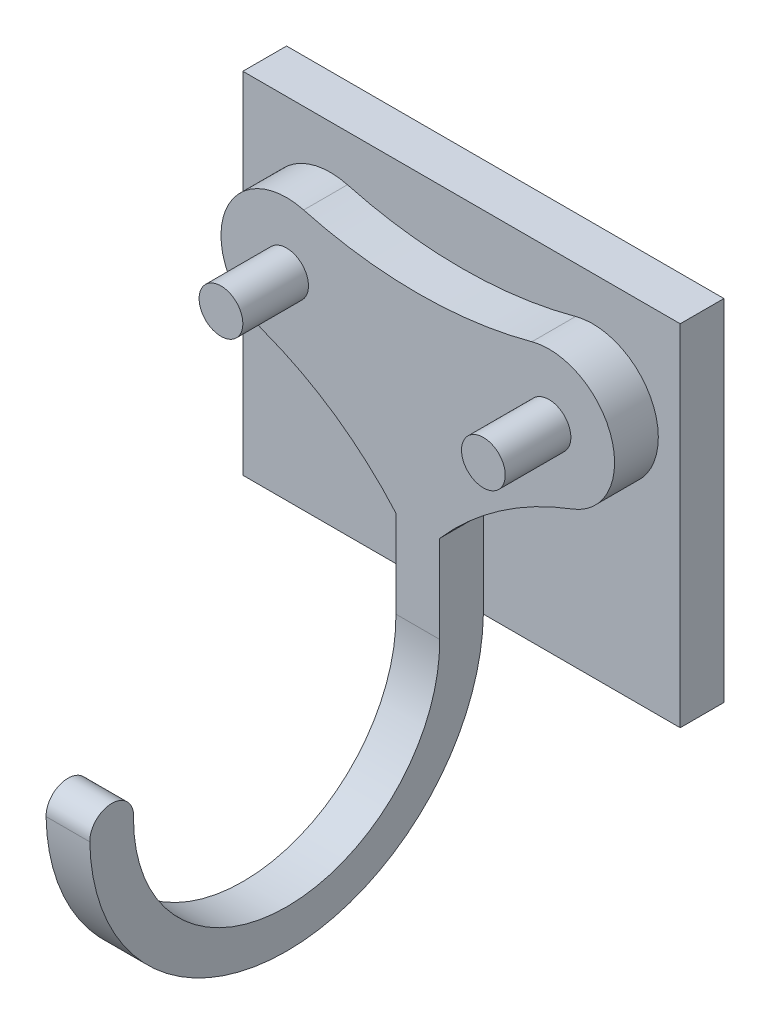
ISO-10303-21;
HEADER;
FILE_DESCRIPTION(('STEP AP214'),'2;1');
FILE_NAME('part.step','',(''),(''),'','','');
FILE_SCHEMA(('AUTOMOTIVE_DESIGN { 1 0 10303 214 1 1 1 1 }'));
ENDSEC;
DATA;
#1=APPLICATION_CONTEXT('core data for automotive mechanical design processes');
#2=APPLICATION_PROTOCOL_DEFINITION('international standard','automotive_design',2000,#1);
#3=PRODUCT_CONTEXT('',#1,'mechanical');
#4=PRODUCT('Part','Part','',(#3));
#5=PRODUCT_RELATED_PRODUCT_CATEGORY('part','',(#4));
#6=PRODUCT_DEFINITION_FORMATION('','',#4);
#7=PRODUCT_DEFINITION_CONTEXT('part definition',#1,'design');
#8=PRODUCT_DEFINITION('design','',#6,#7);
#9=PRODUCT_DEFINITION_SHAPE('','',#8);
#10=(LENGTH_UNIT() NAMED_UNIT(*) SI_UNIT(.MILLI.,.METRE.));
#11=(NAMED_UNIT(*) PLANE_ANGLE_UNIT() SI_UNIT($,.RADIAN.));
#12=(NAMED_UNIT(*) SI_UNIT($,.STERADIAN.) SOLID_ANGLE_UNIT());
#13=UNCERTAINTY_MEASURE_WITH_UNIT(LENGTH_MEASURE(1.E-05),#10,'distance_accuracy_value','');
#14=(GEOMETRIC_REPRESENTATION_CONTEXT(3) GLOBAL_UNCERTAINTY_ASSIGNED_CONTEXT((#13)) GLOBAL_UNIT_ASSIGNED_CONTEXT((#10,
#11,#12)) REPRESENTATION_CONTEXT('',''));
#15=CARTESIAN_POINT('',(0.,0.,0.));
#16=DIRECTION('',(0.,0.,1.));
#17=DIRECTION('',(1.,0.,0.));
#18=AXIS2_PLACEMENT_3D('',#15,#16,#17);
#19=CARTESIAN_POINT('',(-10.,-8.,2.));
#20=DIRECTION('',(-1.,0.,0.));
#21=DIRECTION('',(0.,0.,1.));
#22=AXIS2_PLACEMENT_3D('',#19,#20,#21);
#23=PLANE('',#22);
#24=DIRECTION('',(0.,1.,0.));
#25=VECTOR('',#24,1.);
#26=CARTESIAN_POINT('',(-10.,-8.,0.));
#27=LINE('',#26,#25);
#28=CARTESIAN_POINT('',(-10.,-8.,0.));
#29=VERTEX_POINT('',#28);
#30=CARTESIAN_POINT('',(-10.,8.,0.));
#31=VERTEX_POINT('',#30);
#32=EDGE_CURVE('E202',#29,#31,#27,.T.);
#33=ORIENTED_EDGE('',*,*,#32,.F.);
#34=DIRECTION('',(0.,0.,-1.));
#35=VECTOR('',#34,1.);
#36=CARTESIAN_POINT('',(-10.,-8.,2.));
#37=LINE('',#36,#35);
#38=CARTESIAN_POINT('',(-10.,-8.,2.));
#39=VERTEX_POINT('',#38);
#40=EDGE_CURVE('E11',#39,#29,#37,.T.);
#41=ORIENTED_EDGE('',*,*,#40,.F.);
#42=DIRECTION('',(0.,1.,0.));
#43=VECTOR('',#42,1.);
#44=CARTESIAN_POINT('',(-10.,-8.,2.));
#45=LINE('',#44,#43);
#46=CARTESIAN_POINT('',(-10.,8.,2.));
#47=VERTEX_POINT('',#46);
#48=EDGE_CURVE('E203',#39,#47,#45,.T.);
#49=ORIENTED_EDGE('',*,*,#48,.T.);
#50=DIRECTION('',(0.,0.,-1.));
#51=VECTOR('',#50,1.);
#52=CARTESIAN_POINT('',(-10.,8.,2.));
#53=LINE('',#52,#51);
#54=EDGE_CURVE('E48',#47,#31,#53,.T.);
#55=ORIENTED_EDGE('',*,*,#54,.T.);
#56=EDGE_LOOP('',(#33,#41,#49,#55));
#57=FACE_BOUND('',#56,.T.);
#58=ADVANCED_FACE('F45',(#57),#23,.T.);
#59=CARTESIAN_POINT('',(-10.,-8.,2.));
#60=DIRECTION('',(0.,1.,0.));
#61=DIRECTION('',(0.,0.,1.));
#62=AXIS2_PLACEMENT_3D('',#59,#60,#61);
#63=PLANE('',#62);
#64=DIRECTION('',(0.,0.,-1.));
#65=VECTOR('',#64,1.);
#66=CARTESIAN_POINT('',(0.999999999999999,-8.,4.));
#67=LINE('',#66,#65);
#68=CARTESIAN_POINT('',(1.,-8.,2.00123418032546));
#69=VERTEX_POINT('',#68);
#70=CARTESIAN_POINT('',(0.999999999999999,-8.,2.));
#71=VERTEX_POINT('',#70);
#72=EDGE_CURVE('E168',#69,#71,#67,.T.);
#73=ORIENTED_EDGE('',*,*,#72,.F.);
#74=DIRECTION('',(1.,0.,0.));
#75=VECTOR('',#74,1.);
#76=CARTESIAN_POINT('',(-1.,-8.,2.00123418032546));
#77=LINE('',#76,#75);
#78=CARTESIAN_POINT('',(-1.,-8.,2.00123418032546));
#79=VERTEX_POINT('',#78);
#80=EDGE_CURVE('E152',#79,#69,#77,.T.);
#81=ORIENTED_EDGE('',*,*,#80,.F.);
#82=DIRECTION('',(0.,0.,-1.));
#83=VECTOR('',#82,1.);
#84=CARTESIAN_POINT('',(-0.999999999999999,-8.,4.));
#85=LINE('',#84,#83);
#86=CARTESIAN_POINT('',(-0.999999999999999,-8.,2.));
#87=VERTEX_POINT('',#86);
#88=EDGE_CURVE('E179',#79,#87,#85,.T.);
#89=ORIENTED_EDGE('',*,*,#88,.T.);
#90=DIRECTION('',(1.,0.,0.));
#91=VECTOR('',#90,1.);
#92=CARTESIAN_POINT('',(-10.,-8.,2.));
#93=LINE('',#92,#91);
#94=EDGE_CURVE('E215',#39,#87,#93,.T.);
#95=ORIENTED_EDGE('',*,*,#94,.F.);
#96=ORIENTED_EDGE('',*,*,#40,.T.);
#97=DIRECTION('',(1.,0.,0.));
#98=VECTOR('',#97,1.);
#99=CARTESIAN_POINT('',(-10.,-8.,0.));
#100=LINE('',#99,#98);
#101=CARTESIAN_POINT('',(10.,-8.,0.));
#102=VERTEX_POINT('',#101);
#103=EDGE_CURVE('E208',#29,#102,#100,.T.);
#104=ORIENTED_EDGE('',*,*,#103,.T.);
#105=DIRECTION('',(0.,0.,-1.));
#106=VECTOR('',#105,1.);
#107=CARTESIAN_POINT('',(10.,-8.,2.));
#108=LINE('',#107,#106);
#109=CARTESIAN_POINT('',(10.,-8.,2.));
#110=VERTEX_POINT('',#109);
#111=EDGE_CURVE('E54',#110,#102,#108,.T.);
#112=ORIENTED_EDGE('',*,*,#111,.F.);
#113=EDGE_CURVE('E177',#71,#110,#93,.T.);
#114=ORIENTED_EDGE('',*,*,#113,.F.);
#115=EDGE_LOOP('',(#73,#81,#89,#95,#96,#104,#112,#114));
#116=FACE_BOUND('',#115,.T.);
#117=ADVANCED_FACE('F175',(#116),#63,.F.);
#118=CARTESIAN_POINT('',(10.,-8.,2.));
#119=DIRECTION('',(-1.,0.,0.));
#120=DIRECTION('',(0.,0.,1.));
#121=AXIS2_PLACEMENT_3D('',#118,#119,#120);
#122=PLANE('',#121);
#123=DIRECTION('',(0.,1.,0.));
#124=VECTOR('',#123,1.);
#125=CARTESIAN_POINT('',(10.,-8.,0.));
#126=LINE('',#125,#124);
#127=CARTESIAN_POINT('',(10.,8.,0.));
#128=VERTEX_POINT('',#127);
#129=EDGE_CURVE('E226',#102,#128,#126,.T.);
#130=ORIENTED_EDGE('',*,*,#129,.T.);
#131=DIRECTION('',(0.,0.,-1.));
#132=VECTOR('',#131,1.);
#133=CARTESIAN_POINT('',(10.,8.,2.));
#134=LINE('',#133,#132);
#135=CARTESIAN_POINT('',(10.,8.,2.));
#136=VERTEX_POINT('',#135);
#137=EDGE_CURVE('E234',#136,#128,#134,.T.);
#138=ORIENTED_EDGE('',*,*,#137,.F.);
#139=DIRECTION('',(0.,1.,0.));
#140=VECTOR('',#139,1.);
#141=CARTESIAN_POINT('',(10.,-8.,2.));
#142=LINE('',#141,#140);
#143=EDGE_CURVE('E212',#110,#136,#142,.T.);
#144=ORIENTED_EDGE('',*,*,#143,.F.);
#145=ORIENTED_EDGE('',*,*,#111,.T.);
#146=EDGE_LOOP('',(#130,#138,#144,#145));
#147=FACE_BOUND('',#146,.T.);
#148=ADVANCED_FACE('F252',(#147),#122,.F.);
#149=CARTESIAN_POINT('',(-10.,8.,2.));
#150=DIRECTION('',(0.,1.,0.));
#151=DIRECTION('',(0.,0.,1.));
#152=AXIS2_PLACEMENT_3D('',#149,#150,#151);
#153=PLANE('',#152);
#154=DIRECTION('',(1.,0.,0.));
#155=VECTOR('',#154,1.);
#156=CARTESIAN_POINT('',(-10.,8.,0.));
#157=LINE('',#156,#155);
#158=EDGE_CURVE('E222',#31,#128,#157,.T.);
#159=ORIENTED_EDGE('',*,*,#158,.F.);
#160=ORIENTED_EDGE('',*,*,#54,.F.);
#161=DIRECTION('',(1.,0.,0.));
#162=VECTOR('',#161,1.);
#163=CARTESIAN_POINT('',(-10.,8.,2.));
#164=LINE('',#163,#162);
#165=EDGE_CURVE('E207',#47,#136,#164,.T.);
#166=ORIENTED_EDGE('',*,*,#165,.T.);
#167=ORIENTED_EDGE('',*,*,#137,.T.);
#168=EDGE_LOOP('',(#159,#160,#166,#167));
#169=FACE_BOUND('',#168,.T.);
#170=ADVANCED_FACE('F244',(#169),#153,.T.);
#171=CARTESIAN_POINT('',(0.,0.,2.));
#172=DIRECTION('',(0.,0.,-1.));
#173=DIRECTION('',(-1.,0.,0.));
#174=AXIS2_PLACEMENT_3D('',#171,#172,#173);
#175=PLANE('',#174);
#176=DIRECTION('',(0.,1.,0.));
#177=VECTOR('',#176,1.);
#178=CARTESIAN_POINT('',(0.999999999999999,-8.,2.));
#179=LINE('',#178,#177);
#180=CARTESIAN_POINT('',(1.,-4.,2.));
#181=VERTEX_POINT('',#180);
#182=EDGE_CURVE('E254',#71,#181,#179,.T.);
#183=ORIENTED_EDGE('',*,*,#182,.F.);
#184=ORIENTED_EDGE('',*,*,#113,.T.);
#185=ORIENTED_EDGE('',*,*,#143,.T.);
#186=ORIENTED_EDGE('',*,*,#165,.F.);
#187=ORIENTED_EDGE('',*,*,#48,.F.);
#188=ORIENTED_EDGE('',*,*,#94,.T.);
#189=DIRECTION('',(0.,-1.,0.));
#190=VECTOR('',#189,1.);
#191=CARTESIAN_POINT('',(-0.999999999999999,-8.,2.));
#192=LINE('',#191,#190);
#193=CARTESIAN_POINT('',(-1.,-4.,2.));
#194=VERTEX_POINT('',#193);
#195=EDGE_CURVE('E258',#194,#87,#192,.T.);
#196=ORIENTED_EDGE('',*,*,#195,.F.);
#197=CARTESIAN_POINT('',(-12.303999563958,-13.8599996885414,2.));
#198=DIRECTION('',(0.,0.,-1.));
#199=DIRECTION('',(-1.,0.,0.));
#200=AXIS2_PLACEMENT_3D('',#197,#198,#199);
#201=CIRCLE('',#200,15.);
#202=CARTESIAN_POINT('',(-7.050666593993,0.190000051909764,2.));
#203=VERTEX_POINT('',#202);
#204=EDGE_CURVE('E264',#203,#194,#201,.T.);
#205=ORIENTED_EDGE('',*,*,#204,.F.);
#206=CARTESIAN_POINT('',(-6.,3.,2.));
#207=DIRECTION('',(0.,0.,1.));
#208=DIRECTION('',(1.,0.,0.));
#209=AXIS2_PLACEMENT_3D('',#206,#207,#208);
#210=CIRCLE('',#209,3.);
#211=CARTESIAN_POINT('',(-5.21739130434783,5.89612217102277,2.));
#212=VERTEX_POINT('',#211);
#213=EDGE_CURVE('E307',#212,#203,#210,.T.);
#214=ORIENTED_EDGE('',*,*,#213,.F.);
#215=CARTESIAN_POINT('',(0.,25.2036033111745,2.));
#216=DIRECTION('',(0.,0.,-1.));
#217=DIRECTION('',(1.,0.,0.));
#218=AXIS2_PLACEMENT_3D('',#215,#216,#217);
#219=CIRCLE('',#218,20.);
#220=CARTESIAN_POINT('',(5.21739130434783,5.89612217102276,2.));
#221=VERTEX_POINT('',#220);
#222=EDGE_CURVE('E303',#221,#212,#219,.T.);
#223=ORIENTED_EDGE('',*,*,#222,.F.);
#224=CARTESIAN_POINT('',(6.,3.,2.));
#225=DIRECTION('',(0.,0.,1.));
#226=DIRECTION('',(-1.,0.,0.));
#227=AXIS2_PLACEMENT_3D('',#224,#225,#226);
#228=CIRCLE('',#227,3.);
#229=CARTESIAN_POINT('',(7.050666593993,0.190000051909765,2.));
#230=VERTEX_POINT('',#229);
#231=EDGE_CURVE('E67',#230,#221,#228,.T.);
#232=ORIENTED_EDGE('',*,*,#231,.F.);
#233=CARTESIAN_POINT('',(12.303999563958,-13.8599996885414,2.));
#234=DIRECTION('',(0.,0.,-1.));
#235=DIRECTION('',(-1.,0.,0.));
#236=AXIS2_PLACEMENT_3D('',#233,#234,#235);
#237=CIRCLE('',#236,15.);
#238=EDGE_CURVE('E62',#181,#230,#237,.T.);
#239=ORIENTED_EDGE('',*,*,#238,.F.);
#240=EDGE_LOOP('',(#183,#184,#185,#186,#187,#188,#196,#205,#214,#223,#232,#239));
#241=FACE_BOUND('',#240,.T.);
#242=ADVANCED_FACE('F253',(#241),#175,.F.);
#243=CARTESIAN_POINT('',(0.,0.,0.));
#244=DIRECTION('',(0.,0.,-1.));
#245=DIRECTION('',(-1.,0.,0.));
#246=AXIS2_PLACEMENT_3D('',#243,#244,#245);
#247=PLANE('',#246);
#248=ORIENTED_EDGE('',*,*,#32,.T.);
#249=ORIENTED_EDGE('',*,*,#158,.T.);
#250=ORIENTED_EDGE('',*,*,#129,.F.);
#251=ORIENTED_EDGE('',*,*,#103,.F.);
#252=EDGE_LOOP('',(#248,#249,#250,#251));
#253=FACE_BOUND('',#252,.T.);
#254=ADVANCED_FACE('F248',(#253),#247,.T.);
#255=CARTESIAN_POINT('',(0.,25.2036033111745,4.));
#256=DIRECTION('',(0.,0.,-1.));
#257=DIRECTION('',(-1.,0.,0.));
#258=AXIS2_PLACEMENT_3D('',#255,#256,#257);
#259=CYLINDRICAL_SURFACE('',#258,20.);
#260=ORIENTED_EDGE('',*,*,#222,.T.);
#261=DIRECTION('',(0.,0.,-1.));
#262=VECTOR('',#261,1.);
#263=CARTESIAN_POINT('',(-5.21739130434783,5.89612217102277,4.));
#264=LINE('',#263,#262);
#265=CARTESIAN_POINT('',(-5.21739130434783,5.89612217102277,4.));
#266=VERTEX_POINT('',#265);
#267=EDGE_CURVE('E198',#266,#212,#264,.T.);
#268=ORIENTED_EDGE('',*,*,#267,.F.);
#269=CARTESIAN_POINT('',(0.,25.2036033111745,4.));
#270=DIRECTION('',(0.,0.,-1.));
#271=DIRECTION('',(1.,0.,0.));
#272=AXIS2_PLACEMENT_3D('',#269,#270,#271);
#273=CIRCLE('',#272,20.);
#274=CARTESIAN_POINT('',(5.21739130434783,5.89612217102276,4.));
#275=VERTEX_POINT('',#274);
#276=EDGE_CURVE('E270',#275,#266,#273,.T.);
#277=ORIENTED_EDGE('',*,*,#276,.F.);
#278=DIRECTION('',(0.,0.,-1.));
#279=VECTOR('',#278,1.);
#280=CARTESIAN_POINT('',(5.21739130434783,5.89612217102276,4.));
#281=LINE('',#280,#279);
#282=EDGE_CURVE('E271',#275,#221,#281,.T.);
#283=ORIENTED_EDGE('',*,*,#282,.T.);
#284=EDGE_LOOP('',(#260,#268,#277,#283));
#285=FACE_BOUND('',#284,.T.);
#286=ADVANCED_FACE('F412',(#285),#259,.F.);
#287=CARTESIAN_POINT('',(-6.,3.,4.));
#288=DIRECTION('',(0.,0.,-1.));
#289=DIRECTION('',(-1.,0.,0.));
#290=AXIS2_PLACEMENT_3D('',#287,#288,#289);
#291=CYLINDRICAL_SURFACE('',#290,3.);
#292=ORIENTED_EDGE('',*,*,#213,.T.);
#293=DIRECTION('',(0.,0.,-1.));
#294=VECTOR('',#293,1.);
#295=CARTESIAN_POINT('',(-7.050666593993,0.190000051909764,4.));
#296=LINE('',#295,#294);
#297=CARTESIAN_POINT('',(-7.050666593993,0.190000051909764,4.));
#298=VERTEX_POINT('',#297);
#299=EDGE_CURVE('E194',#298,#203,#296,.T.);
#300=ORIENTED_EDGE('',*,*,#299,.F.);
#301=CARTESIAN_POINT('',(-6.,3.,4.));
#302=DIRECTION('',(0.,0.,1.));
#303=DIRECTION('',(1.,0.,0.));
#304=AXIS2_PLACEMENT_3D('',#301,#302,#303);
#305=CIRCLE('',#304,3.);
#306=EDGE_CURVE('E329',#266,#298,#305,.T.);
#307=ORIENTED_EDGE('',*,*,#306,.F.);
#308=ORIENTED_EDGE('',*,*,#267,.T.);
#309=EDGE_LOOP('',(#292,#300,#307,#308));
#310=FACE_BOUND('',#309,.T.);
#311=ADVANCED_FACE('F415',(#310),#291,.T.);
#312=CARTESIAN_POINT('',(-12.303999563958,-13.8599996885414,4.));
#313=DIRECTION('',(0.,0.,-1.));
#314=DIRECTION('',(-1.,0.,0.));
#315=AXIS2_PLACEMENT_3D('',#312,#313,#314);
#316=CYLINDRICAL_SURFACE('',#315,15.);
#317=ORIENTED_EDGE('',*,*,#204,.T.);
#318=DIRECTION('',(0.,0.,-1.));
#319=VECTOR('',#318,1.);
#320=CARTESIAN_POINT('',(-1.,-4.,4.));
#321=LINE('',#320,#319);
#322=CARTESIAN_POINT('',(-1.,-4.,4.));
#323=VERTEX_POINT('',#322);
#324=EDGE_CURVE('E184',#323,#194,#321,.T.);
#325=ORIENTED_EDGE('',*,*,#324,.F.);
#326=CARTESIAN_POINT('',(-12.303999563958,-13.8599996885414,4.));
#327=DIRECTION('',(0.,0.,-1.));
#328=DIRECTION('',(-1.,0.,0.));
#329=AXIS2_PLACEMENT_3D('',#326,#327,#328);
#330=CIRCLE('',#329,15.);
#331=EDGE_CURVE('E327',#298,#323,#330,.T.);
#332=ORIENTED_EDGE('',*,*,#331,.F.);
#333=ORIENTED_EDGE('',*,*,#299,.T.);
#334=EDGE_LOOP('',(#317,#325,#332,#333));
#335=FACE_BOUND('',#334,.T.);
#336=ADVANCED_FACE('F315',(#335),#316,.F.);
#337=CARTESIAN_POINT('',(-0.999999999999999,-8.,4.));
#338=DIRECTION('',(1.,0.,0.));
#339=DIRECTION('',(0.,1.,0.));
#340=AXIS2_PLACEMENT_3D('',#337,#338,#339);
#341=PLANE('',#340);
#342=ORIENTED_EDGE('',*,*,#195,.T.);
#343=ORIENTED_EDGE('',*,*,#88,.F.);
#344=CARTESIAN_POINT('',(-1.,-7.85095731263437,11.));
#345=DIRECTION('',(1.,0.,0.));
#346=DIRECTION('',(0.,0.,-1.));
#347=AXIS2_PLACEMENT_3D('',#344,#345,#346);
#348=CIRCLE('',#347,9.);
#349=CARTESIAN_POINT('',(-1.,-8.01868566217979,19.9984369309763));
#350=VERTEX_POINT('',#349);
#351=EDGE_CURVE('E157',#350,#79,#348,.T.);
#352=ORIENTED_EDGE('',*,*,#351,.F.);
#353=CARTESIAN_POINT('',(-1.,-8.,18.9959722129122));
#354=DIRECTION('',(1.,0.,0.));
#355=DIRECTION('',(0.,0.,-1.));
#356=AXIS2_PLACEMENT_3D('',#353,#354,#355);
#357=CIRCLE('',#356,1.00263885070069);
#358=CARTESIAN_POINT('',(-1.,-8.10956674094291,17.9993379799995));
#359=VERTEX_POINT('',#358);
#360=EDGE_CURVE('E358',#359,#350,#357,.T.);
#361=ORIENTED_EDGE('',*,*,#360,.F.);
#362=CARTESIAN_POINT('',(-1.,-8.09519021077675,10.9993527432022));
#363=DIRECTION('',(-1.,0.,0.));
#364=DIRECTION('',(0.,0.,1.));
#365=AXIS2_PLACEMENT_3D('',#362,#363,#364);
#366=CIRCLE('',#365,7.);
#367=CARTESIAN_POINT('',(-1.,-8.,4.));
#368=VERTEX_POINT('',#367);
#369=EDGE_CURVE('E325',#368,#359,#366,.T.);
#370=ORIENTED_EDGE('',*,*,#369,.F.);
#371=DIRECTION('',(0.,-1.,0.));
#372=VECTOR('',#371,1.);
#373=CARTESIAN_POINT('',(-0.999999999999999,-8.,4.));
#374=LINE('',#373,#372);
#375=EDGE_CURVE('E297',#323,#368,#374,.T.);
#376=ORIENTED_EDGE('',*,*,#375,.F.);
#377=ORIENTED_EDGE('',*,*,#324,.T.);
#378=EDGE_LOOP('',(#342,#343,#352,#361,#370,#376,#377));
#379=FACE_BOUND('',#378,.T.);
#380=ADVANCED_FACE('F320',(#379),#341,.F.);
#381=CARTESIAN_POINT('',(0.999999999999999,-8.,4.));
#382=DIRECTION('',(-1.,0.,0.));
#383=DIRECTION('',(0.,-1.,0.));
#384=AXIS2_PLACEMENT_3D('',#381,#382,#383);
#385=PLANE('',#384);
#386=ORIENTED_EDGE('',*,*,#182,.T.);
#387=DIRECTION('',(0.,0.,-1.));
#388=VECTOR('',#387,1.);
#389=CARTESIAN_POINT('',(1.,-4.,4.));
#390=LINE('',#389,#388);
#391=CARTESIAN_POINT('',(1.,-4.,4.));
#392=VERTEX_POINT('',#391);
#393=EDGE_CURVE('E180',#392,#181,#390,.T.);
#394=ORIENTED_EDGE('',*,*,#393,.F.);
#395=DIRECTION('',(0.,1.,0.));
#396=VECTOR('',#395,1.);
#397=CARTESIAN_POINT('',(0.999999999999999,-8.,4.));
#398=LINE('',#397,#396);
#399=CARTESIAN_POINT('',(0.999999999999999,-8.,4.));
#400=VERTEX_POINT('',#399);
#401=EDGE_CURVE('E287',#400,#392,#398,.T.);
#402=ORIENTED_EDGE('',*,*,#401,.F.);
#403=CARTESIAN_POINT('',(1.,-8.09519021077675,10.9993527432022));
#404=DIRECTION('',(-1.,0.,0.));
#405=DIRECTION('',(0.,0.,1.));
#406=AXIS2_PLACEMENT_3D('',#403,#404,#405);
#407=CIRCLE('',#406,7.);
#408=CARTESIAN_POINT('',(1.,-8.10956674094291,17.9993379799995));
#409=VERTEX_POINT('',#408);
#410=EDGE_CURVE('E288',#400,#409,#407,.T.);
#411=ORIENTED_EDGE('',*,*,#410,.T.);
#412=CARTESIAN_POINT('',(1.,-8.,18.9959722129122));
#413=DIRECTION('',(1.,0.,0.));
#414=DIRECTION('',(0.,0.,-1.));
#415=AXIS2_PLACEMENT_3D('',#412,#413,#414);
#416=CIRCLE('',#415,1.00263885070069);
#417=CARTESIAN_POINT('',(1.,-8.01868566217979,19.9984369309763));
#418=VERTEX_POINT('',#417);
#419=EDGE_CURVE('E171',#409,#418,#416,.T.);
#420=ORIENTED_EDGE('',*,*,#419,.T.);
#421=CARTESIAN_POINT('',(1.,-7.85095731263437,11.));
#422=DIRECTION('',(1.,0.,0.));
#423=DIRECTION('',(0.,0.,-1.));
#424=AXIS2_PLACEMENT_3D('',#421,#422,#423);
#425=CIRCLE('',#424,9.);
#426=EDGE_CURVE('E155',#418,#69,#425,.T.);
#427=ORIENTED_EDGE('',*,*,#426,.T.);
#428=ORIENTED_EDGE('',*,*,#72,.T.);
#429=EDGE_LOOP('',(#386,#394,#402,#411,#420,#427,#428));
#430=FACE_BOUND('',#429,.T.);
#431=ADVANCED_FACE('F167',(#430),#385,.F.);
#432=CARTESIAN_POINT('',(12.303999563958,-13.8599996885414,4.));
#433=DIRECTION('',(0.,0.,-1.));
#434=DIRECTION('',(-1.,0.,0.));
#435=AXIS2_PLACEMENT_3D('',#432,#433,#434);
#436=CYLINDRICAL_SURFACE('',#435,15.);
#437=ORIENTED_EDGE('',*,*,#238,.T.);
#438=DIRECTION('',(0.,0.,-1.));
#439=VECTOR('',#438,1.);
#440=CARTESIAN_POINT('',(7.050666593993,0.190000051909765,4.));
#441=LINE('',#440,#439);
#442=CARTESIAN_POINT('',(7.050666593993,0.190000051909765,4.));
#443=VERTEX_POINT('',#442);
#444=EDGE_CURVE('E187',#443,#230,#441,.T.);
#445=ORIENTED_EDGE('',*,*,#444,.F.);
#446=CARTESIAN_POINT('',(12.303999563958,-13.8599996885414,4.));
#447=DIRECTION('',(0.,0.,-1.));
#448=DIRECTION('',(-1.,0.,0.));
#449=AXIS2_PLACEMENT_3D('',#446,#447,#448);
#450=CIRCLE('',#449,15.);
#451=EDGE_CURVE('E285',#392,#443,#450,.T.);
#452=ORIENTED_EDGE('',*,*,#451,.F.);
#453=ORIENTED_EDGE('',*,*,#393,.T.);
#454=EDGE_LOOP('',(#437,#445,#452,#453));
#455=FACE_BOUND('',#454,.T.);
#456=ADVANCED_FACE('F284',(#455),#436,.F.);
#457=CARTESIAN_POINT('',(6.,3.,4.));
#458=DIRECTION('',(0.,0.,-1.));
#459=DIRECTION('',(-1.,0.,0.));
#460=AXIS2_PLACEMENT_3D('',#457,#458,#459);
#461=CYLINDRICAL_SURFACE('',#460,3.);
#462=ORIENTED_EDGE('',*,*,#231,.T.);
#463=ORIENTED_EDGE('',*,*,#282,.F.);
#464=CARTESIAN_POINT('',(6.,3.,4.));
#465=DIRECTION('',(0.,0.,1.));
#466=DIRECTION('',(-1.,0.,0.));
#467=AXIS2_PLACEMENT_3D('',#464,#465,#466);
#468=CIRCLE('',#467,3.);
#469=EDGE_CURVE('E274',#443,#275,#468,.T.);
#470=ORIENTED_EDGE('',*,*,#469,.F.);
#471=ORIENTED_EDGE('',*,*,#444,.T.);
#472=EDGE_LOOP('',(#462,#463,#470,#471));
#473=FACE_BOUND('',#472,.T.);
#474=ADVANCED_FACE('F280',(#473),#461,.T.);
#475=CARTESIAN_POINT('',(0.,25.2036033111745,4.));
#476=DIRECTION('',(0.,0.,1.));
#477=DIRECTION('',(1.,0.,0.));
#478=AXIS2_PLACEMENT_3D('',#475,#476,#477);
#479=PLANE('',#478);
#480=CARTESIAN_POINT('',(-6.,3.,4.));
#481=DIRECTION('',(0.,0.,1.));
#482=DIRECTION('',(1.,0.,0.));
#483=AXIS2_PLACEMENT_3D('',#480,#481,#482);
#484=CIRCLE('',#483,1.);
#485=CARTESIAN_POINT('',(-5.,3.,4.));
#486=VERTEX_POINT('',#485);
#487=EDGE_CURVE('E344',#486,#486,#484,.T.);
#488=ORIENTED_EDGE('',*,*,#487,.F.);
#489=EDGE_LOOP('',(#488));
#490=FACE_BOUND('',#489,.T.);
#491=CARTESIAN_POINT('',(6.,3.,4.));
#492=DIRECTION('',(0.,0.,1.));
#493=DIRECTION('',(-1.,0.,0.));
#494=AXIS2_PLACEMENT_3D('',#491,#492,#493);
#495=CIRCLE('',#494,1.);
#496=CARTESIAN_POINT('',(5.,3.,4.));
#497=VERTEX_POINT('',#496);
#498=EDGE_CURVE('E340',#497,#497,#495,.T.);
#499=ORIENTED_EDGE('',*,*,#498,.F.);
#500=EDGE_LOOP('',(#499));
#501=FACE_BOUND('',#500,.T.);
#502=ORIENTED_EDGE('',*,*,#276,.T.);
#503=ORIENTED_EDGE('',*,*,#306,.T.);
#504=ORIENTED_EDGE('',*,*,#331,.T.);
#505=ORIENTED_EDGE('',*,*,#375,.T.);
#506=DIRECTION('',(1.,0.,0.));
#507=VECTOR('',#506,1.);
#508=CARTESIAN_POINT('',(-0.999999999999999,-8.,4.));
#509=LINE('',#508,#507);
#510=EDGE_CURVE('E292',#368,#400,#509,.T.);
#511=ORIENTED_EDGE('',*,*,#510,.T.);
#512=ORIENTED_EDGE('',*,*,#401,.T.);
#513=ORIENTED_EDGE('',*,*,#451,.T.);
#514=ORIENTED_EDGE('',*,*,#469,.T.);
#515=EDGE_LOOP('',(#502,#503,#504,#505,#511,#512,#513,#514));
#516=FACE_BOUND('',#515,.T.);
#517=ADVANCED_FACE('F371',(#490,#501,#516),#479,.T.);
#518=CARTESIAN_POINT('',(6.,3.,7.));
#519=DIRECTION('',(0.,0.,-1.));
#520=DIRECTION('',(-1.,0.,0.));
#521=AXIS2_PLACEMENT_3D('',#518,#519,#520);
#522=CYLINDRICAL_SURFACE('',#521,1.);
#523=CARTESIAN_POINT('',(6.,3.,7.));
#524=DIRECTION('',(0.,0.,1.));
#525=DIRECTION('',(-1.,0.,0.));
#526=AXIS2_PLACEMENT_3D('',#523,#524,#525);
#527=CIRCLE('',#526,1.);
#528=CARTESIAN_POINT('',(5.,3.,7.));
#529=VERTEX_POINT('',#528);
#530=EDGE_CURVE('E162',#529,#529,#527,.T.);
#531=ORIENTED_EDGE('',*,*,#530,.F.);
#532=EDGE_LOOP('',(#531));
#533=FACE_BOUND('',#532,.T.);
#534=ORIENTED_EDGE('',*,*,#498,.T.);
#535=EDGE_LOOP('',(#534));
#536=FACE_BOUND('',#535,.T.);
#537=ADVANCED_FACE('F375',(#533,#536),#522,.T.);
#538=CARTESIAN_POINT('',(6.,3.,7.));
#539=DIRECTION('',(0.,0.,-1.));
#540=DIRECTION('',(-1.,0.,0.));
#541=AXIS2_PLACEMENT_3D('',#538,#539,#540);
#542=PLANE('',#541);
#543=ORIENTED_EDGE('',*,*,#530,.T.);
#544=EDGE_LOOP('',(#543));
#545=FACE_BOUND('',#544,.T.);
#546=ADVANCED_FACE('F383',(#545),#542,.F.);
#547=CARTESIAN_POINT('',(-6.,3.,7.));
#548=DIRECTION('',(0.,0.,-1.));
#549=DIRECTION('',(-1.,0.,0.));
#550=AXIS2_PLACEMENT_3D('',#547,#548,#549);
#551=CYLINDRICAL_SURFACE('',#550,1.);
#552=CARTESIAN_POINT('',(-6.,3.,7.));
#553=DIRECTION('',(0.,0.,1.));
#554=DIRECTION('',(1.,0.,0.));
#555=AXIS2_PLACEMENT_3D('',#552,#553,#554);
#556=CIRCLE('',#555,1.);
#557=CARTESIAN_POINT('',(-5.,3.,7.));
#558=VERTEX_POINT('',#557);
#559=EDGE_CURVE('E308',#558,#558,#556,.T.);
#560=ORIENTED_EDGE('',*,*,#559,.F.);
#561=EDGE_LOOP('',(#560));
#562=FACE_BOUND('',#561,.T.);
#563=ORIENTED_EDGE('',*,*,#487,.T.);
#564=EDGE_LOOP('',(#563));
#565=FACE_BOUND('',#564,.T.);
#566=ADVANCED_FACE('F447',(#562,#565),#551,.T.);
#567=CARTESIAN_POINT('',(-6.,3.,7.));
#568=DIRECTION('',(0.,0.,1.));
#569=DIRECTION('',(1.,0.,0.));
#570=AXIS2_PLACEMENT_3D('',#567,#568,#569);
#571=PLANE('',#570);
#572=ORIENTED_EDGE('',*,*,#559,.T.);
#573=EDGE_LOOP('',(#572));
#574=FACE_BOUND('',#573,.T.);
#575=ADVANCED_FACE('F454',(#574),#571,.T.);
#576=CARTESIAN_POINT('',(-1.,-7.85095731263437,11.));
#577=DIRECTION('',(1.,0.,0.));
#578=DIRECTION('',(0.,0.,-1.));
#579=AXIS2_PLACEMENT_3D('',#576,#577,#578);
#580=CYLINDRICAL_SURFACE('',#579,9.);
#581=ORIENTED_EDGE('',*,*,#80,.T.);
#582=ORIENTED_EDGE('',*,*,#426,.F.);
#583=DIRECTION('',(1.,0.,0.));
#584=VECTOR('',#583,1.);
#585=CARTESIAN_POINT('',(-1.,-8.01868566217979,19.9984369309763));
#586=LINE('',#585,#584);
#587=EDGE_CURVE('E163',#350,#418,#586,.T.);
#588=ORIENTED_EDGE('',*,*,#587,.F.);
#589=ORIENTED_EDGE('',*,*,#351,.T.);
#590=EDGE_LOOP('',(#581,#582,#588,#589));
#591=FACE_BOUND('',#590,.T.);
#592=ADVANCED_FACE('F154',(#591),#580,.T.);
#593=CARTESIAN_POINT('',(-1.,-8.,18.9959722129122));
#594=DIRECTION('',(1.,0.,0.));
#595=DIRECTION('',(0.,0.,-1.));
#596=AXIS2_PLACEMENT_3D('',#593,#594,#595);
#597=CYLINDRICAL_SURFACE('',#596,1.00263885070069);
#598=ORIENTED_EDGE('',*,*,#587,.T.);
#599=ORIENTED_EDGE('',*,*,#419,.F.);
#600=DIRECTION('',(1.,0.,0.));
#601=VECTOR('',#600,1.);
#602=CARTESIAN_POINT('',(-1.,-8.10956674094291,17.9993379799995));
#603=LINE('',#602,#601);
#604=EDGE_CURVE('E353',#359,#409,#603,.T.);
#605=ORIENTED_EDGE('',*,*,#604,.F.);
#606=ORIENTED_EDGE('',*,*,#360,.T.);
#607=EDGE_LOOP('',(#598,#599,#605,#606));
#608=FACE_BOUND('',#607,.T.);
#609=ADVANCED_FACE('F368',(#608),#597,.T.);
#610=CARTESIAN_POINT('',(-1.,-8.09519021077675,10.9993527432022));
#611=DIRECTION('',(1.,0.,0.));
#612=DIRECTION('',(0.,0.,-1.));
#613=AXIS2_PLACEMENT_3D('',#610,#611,#612);
#614=CYLINDRICAL_SURFACE('',#613,7.);
#615=ORIENTED_EDGE('',*,*,#604,.T.);
#616=ORIENTED_EDGE('',*,*,#410,.F.);
#617=ORIENTED_EDGE('',*,*,#510,.F.);
#618=ORIENTED_EDGE('',*,*,#369,.T.);
#619=EDGE_LOOP('',(#615,#616,#617,#618));
#620=FACE_BOUND('',#619,.T.);
#621=ADVANCED_FACE('F370',(#620),#614,.F.);
#622=CLOSED_SHELL('',(#58,#117,#148,#170,#242,#254,#286,#311,#336,#380,#431,#456,#474,#517,#537,
#546,#566,#575,#592,#609,#621));
#623=MANIFOLD_SOLID_BREP('B2',#622);
#624=ADVANCED_BREP_SHAPE_REPRESENTATION('',(#18,#623),#14);
#625=SHAPE_DEFINITION_REPRESENTATION(#9,#624);
ENDSEC;
END-ISO-10303-21;
